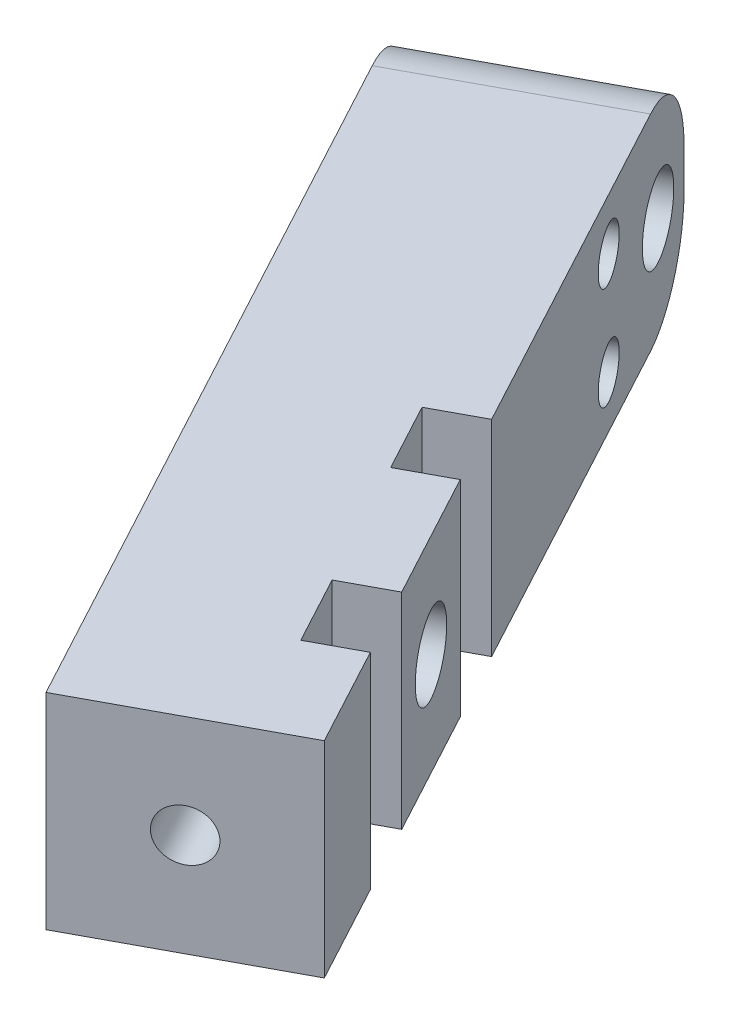
ISO-10303-21;
HEADER;
FILE_DESCRIPTION(('STEP AP214'),'2;1');
FILE_NAME('part.step','',(''),(''),'','','');
FILE_SCHEMA(('AUTOMOTIVE_DESIGN { 1 0 10303 214 1 1 1 1 }'));
ENDSEC;
DATA;
#1=APPLICATION_CONTEXT('core data for automotive mechanical design processes');
#2=APPLICATION_PROTOCOL_DEFINITION('international standard','automotive_design',2000,#1);
#3=PRODUCT_CONTEXT('',#1,'mechanical');
#4=PRODUCT('Part','Part','',(#3));
#5=PRODUCT_RELATED_PRODUCT_CATEGORY('part','',(#4));
#6=PRODUCT_DEFINITION_FORMATION('','',#4);
#7=PRODUCT_DEFINITION_CONTEXT('part definition',#1,'design');
#8=PRODUCT_DEFINITION('design','',#6,#7);
#9=PRODUCT_DEFINITION_SHAPE('','',#8);
#10=(LENGTH_UNIT() NAMED_UNIT(*) SI_UNIT(.MILLI.,.METRE.));
#11=(NAMED_UNIT(*) PLANE_ANGLE_UNIT() SI_UNIT($,.RADIAN.));
#12=(NAMED_UNIT(*) SI_UNIT($,.STERADIAN.) SOLID_ANGLE_UNIT());
#13=UNCERTAINTY_MEASURE_WITH_UNIT(LENGTH_MEASURE(1.E-05),#10,'distance_accuracy_value','');
#14=(GEOMETRIC_REPRESENTATION_CONTEXT(3) GLOBAL_UNCERTAINTY_ASSIGNED_CONTEXT((#13)) GLOBAL_UNIT_ASSIGNED_CONTEXT((#10,
#11,#12)) REPRESENTATION_CONTEXT('',''));
#15=CARTESIAN_POINT('',(0.,0.,0.));
#16=DIRECTION('',(0.,0.,1.));
#17=DIRECTION('',(1.,0.,0.));
#18=AXIS2_PLACEMENT_3D('',#15,#16,#17);
#19=CARTESIAN_POINT('',(473.518002347023,1000.,385.070267512742));
#20=DIRECTION('',(-0.473688349911593,0.,-0.8806925383799));
#21=DIRECTION('',(-0.8806925383799,0.,0.473688349911593));
#22=AXIS2_PLACEMENT_3D('',#19,#20,#21);
#23=PLANE('',#22);
#24=CARTESIAN_POINT('',(33.1717331570737,500.,621.914442468539));
#25=DIRECTION('',(0.473688349911594,0.,0.8806925383799));
#26=DIRECTION('',(0.8806925383799,0.,-0.473688349911594));
#27=AXIS2_PLACEMENT_3D('',#24,#25,#26);
#28=CIRCLE('',#27,125.);
#29=CARTESIAN_POINT('',(143.258300454561,500.,562.70339872959));
#30=VERTEX_POINT('',#29);
#31=EDGE_CURVE('E482',#30,#30,#28,.T.);
#32=ORIENTED_EDGE('',*,*,#31,.F.);
#33=EDGE_LOOP('',(#32));
#34=FACE_BOUND('',#33,.T.);
#35=DIRECTION('',(0.8806925383799,0.,-0.473688349911593));
#36=VECTOR('',#35,1.);
#37=CARTESIAN_POINT('',(473.518002347023,0.,385.070267512742));
#38=LINE('',#37,#36);
#39=CARTESIAN_POINT('',(-407.174536032876,0.,858.758617424335));
#40=VERTEX_POINT('',#39);
#41=CARTESIAN_POINT('',(473.518002347023,0.,385.070267512742));
#42=VERTEX_POINT('',#41);
#43=EDGE_CURVE('E159',#40,#42,#38,.T.);
#44=ORIENTED_EDGE('',*,*,#43,.T.);
#45=DIRECTION('',(0.,-1.,0.));
#46=VECTOR('',#45,1.);
#47=CARTESIAN_POINT('',(473.518002347023,1000.,385.070267512742));
#48=LINE('',#47,#46);
#49=CARTESIAN_POINT('',(473.518002347023,1000.,385.070267512742));
#50=VERTEX_POINT('',#49);
#51=EDGE_CURVE('E140',#50,#42,#48,.T.);
#52=ORIENTED_EDGE('',*,*,#51,.F.);
#53=DIRECTION('',(0.8806925383799,0.,-0.473688349911593));
#54=VECTOR('',#53,1.);
#55=CARTESIAN_POINT('',(473.518002347023,1000.,385.070267512742));
#56=LINE('',#55,#54);
#57=CARTESIAN_POINT('',(-407.174536032876,1000.,858.758617424335));
#58=VERTEX_POINT('',#57);
#59=EDGE_CURVE('E147',#58,#50,#56,.T.);
#60=ORIENTED_EDGE('',*,*,#59,.F.);
#61=DIRECTION('',(0.,-1.,0.));
#62=VECTOR('',#61,1.);
#63=CARTESIAN_POINT('',(-407.174536032876,1000.,858.758617424335));
#64=LINE('',#63,#62);
#65=EDGE_CURVE('E201',#58,#40,#64,.T.);
#66=ORIENTED_EDGE('',*,*,#65,.T.);
#67=EDGE_LOOP('',(#44,#52,#60,#66));
#68=FACE_BOUND('',#67,.T.);
#69=ADVANCED_FACE('F33',(#34,#68),#23,.F.);
#70=CARTESIAN_POINT('',(473.518002347023,1000.,385.070267512742));
#71=DIRECTION('',(-0.880692538379901,0.,0.473688349911593));
#72=DIRECTION('',(0.473688349911593,0.,0.880692538379901));
#73=AXIS2_PLACEMENT_3D('',#70,#71,#72);
#74=PLANE('',#73);
#75=DIRECTION('',(-0.473688349911593,0.,-0.880692538379901));
#76=VECTOR('',#75,1.);
#77=CARTESIAN_POINT('',(473.518002347023,0.,385.070267512742));
#78=LINE('',#77,#76);
#79=CARTESIAN_POINT('',(212.989409895647,0.,-99.3106285962031));
#80=VERTEX_POINT('',#79);
#81=EDGE_CURVE('E237',#42,#80,#78,.T.);
#82=ORIENTED_EDGE('',*,*,#81,.T.);
#83=DIRECTION('',(0.,-1.,0.));
#84=VECTOR('',#83,1.);
#85=CARTESIAN_POINT('',(212.989409895647,1000.,-99.3106285962031));
#86=LINE('',#85,#84);
#87=CARTESIAN_POINT('',(212.989409895647,1000.,-99.3106285962031));
#88=VERTEX_POINT('',#87);
#89=EDGE_CURVE('E143',#88,#80,#86,.T.);
#90=ORIENTED_EDGE('',*,*,#89,.F.);
#91=DIRECTION('',(-0.473688349911593,0.,-0.880692538379901));
#92=VECTOR('',#91,1.);
#93=CARTESIAN_POINT('',(473.518002347023,1000.,385.070267512742));
#94=LINE('',#93,#92);
#95=EDGE_CURVE('E136',#50,#88,#94,.T.);
#96=ORIENTED_EDGE('',*,*,#95,.F.);
#97=ORIENTED_EDGE('',*,*,#51,.T.);
#98=EDGE_LOOP('',(#82,#90,#96,#97));
#99=FACE_BOUND('',#98,.T.);
#100=ADVANCED_FACE('F138',(#99),#74,.F.);
#101=CARTESIAN_POINT('',(212.989409895647,1000.,-99.3106285962031));
#102=DIRECTION('',(0.473688349911593,0.,0.8806925383799));
#103=DIRECTION('',(0.8806925383799,0.,-0.473688349911593));
#104=AXIS2_PLACEMENT_3D('',#101,#102,#103);
#105=PLANE('',#104);
#106=DIRECTION('',(-0.8806925383799,0.,0.473688349911593));
#107=VECTOR('',#106,1.);
#108=CARTESIAN_POINT('',(212.989409895647,0.,-99.3106285962031));
#109=LINE('',#108,#107);
#110=CARTESIAN_POINT('',(-7.18372469931982,0.,19.1114588816911));
#111=VERTEX_POINT('',#110);
#112=EDGE_CURVE('E231',#80,#111,#109,.T.);
#113=ORIENTED_EDGE('',*,*,#112,.T.);
#114=DIRECTION('',(0.,-1.,0.));
#115=VECTOR('',#114,1.);
#116=CARTESIAN_POINT('',(-7.18372469931982,1000.,19.1114588816911));
#117=LINE('',#116,#115);
#118=CARTESIAN_POINT('',(-7.18372469931982,1000.,19.1114588816911));
#119=VERTEX_POINT('',#118);
#120=EDGE_CURVE('E165',#119,#111,#117,.T.);
#121=ORIENTED_EDGE('',*,*,#120,.F.);
#122=DIRECTION('',(-0.8806925383799,0.,0.473688349911593));
#123=VECTOR('',#122,1.);
#124=CARTESIAN_POINT('',(212.989409895647,1000.,-99.3106285962031));
#125=LINE('',#124,#123);
#126=EDGE_CURVE('E146',#88,#119,#125,.T.);
#127=ORIENTED_EDGE('',*,*,#126,.F.);
#128=ORIENTED_EDGE('',*,*,#89,.T.);
#129=EDGE_LOOP('',(#113,#121,#127,#128));
#130=FACE_BOUND('',#129,.T.);
#131=ADVANCED_FACE('F262',(#130),#105,.F.);
#132=CARTESIAN_POINT('',(-7.18372469931982,1000.,19.1114588816911));
#133=DIRECTION('',(-0.8806925383799,0.,0.473688349911593));
#134=DIRECTION('',(0.473688349911593,0.,0.8806925383799));
#135=AXIS2_PLACEMENT_3D('',#132,#133,#134);
#136=PLANE('',#135);
#137=DIRECTION('',(-0.473688349911593,0.,-0.8806925383799));
#138=VECTOR('',#137,1.);
#139=CARTESIAN_POINT('',(-7.18372469931982,0.,19.1114588816911));
#140=LINE('',#139,#138);
#141=CARTESIAN_POINT('',(-184.816855916168,0.,-311.148243010772));
#142=VERTEX_POINT('',#141);
#143=EDGE_CURVE('E226',#111,#142,#140,.T.);
#144=ORIENTED_EDGE('',*,*,#143,.T.);
#145=DIRECTION('',(0.,-1.,0.));
#146=VECTOR('',#145,1.);
#147=CARTESIAN_POINT('',(-184.816855916168,1000.,-311.148243010772));
#148=LINE('',#147,#146);
#149=CARTESIAN_POINT('',(-184.816855916168,1000.,-311.148243010772));
#150=VERTEX_POINT('',#149);
#151=EDGE_CURVE('E217',#150,#142,#148,.T.);
#152=ORIENTED_EDGE('',*,*,#151,.F.);
#153=DIRECTION('',(-0.473688349911593,0.,-0.8806925383799));
#154=VECTOR('',#153,1.);
#155=CARTESIAN_POINT('',(-7.18372469931982,1000.,19.1114588816911));
#156=LINE('',#155,#154);
#157=EDGE_CURVE('E227',#119,#150,#156,.T.);
#158=ORIENTED_EDGE('',*,*,#157,.F.);
#159=ORIENTED_EDGE('',*,*,#120,.T.);
#160=EDGE_LOOP('',(#144,#152,#158,#159));
#161=FACE_BOUND('',#160,.T.);
#162=ADVANCED_FACE('F224',(#161),#136,.F.);
#163=CARTESIAN_POINT('',(-184.816855916168,1000.,-311.148243010772));
#164=DIRECTION('',(-0.473688349911593,0.,-0.8806925383799));
#165=DIRECTION('',(-0.8806925383799,0.,0.473688349911593));
#166=AXIS2_PLACEMENT_3D('',#163,#164,#165);
#167=PLANE('',#166);
#168=DIRECTION('',(0.8806925383799,0.,-0.473688349911593));
#169=VECTOR('',#168,1.);
#170=CARTESIAN_POINT('',(-184.816855916168,0.,-311.148243010772));
#171=LINE('',#170,#169);
#172=CARTESIAN_POINT('',(35.3562786788065,0.,-429.57033048867));
#173=VERTEX_POINT('',#172);
#174=EDGE_CURVE('E233',#142,#173,#171,.T.);
#175=ORIENTED_EDGE('',*,*,#174,.T.);
#176=DIRECTION('',(0.,-1.,0.));
#177=VECTOR('',#176,1.);
#178=CARTESIAN_POINT('',(35.3562786788065,1000.,-429.57033048867));
#179=LINE('',#178,#177);
#180=CARTESIAN_POINT('',(35.3562786788065,1000.,-429.57033048867));
#181=VERTEX_POINT('',#180);
#182=EDGE_CURVE('E214',#181,#173,#179,.T.);
#183=ORIENTED_EDGE('',*,*,#182,.F.);
#184=DIRECTION('',(0.8806925383799,0.,-0.473688349911593));
#185=VECTOR('',#184,1.);
#186=CARTESIAN_POINT('',(-184.816855916168,1000.,-311.148243010772));
#187=LINE('',#186,#185);
#188=EDGE_CURVE('E264',#150,#181,#187,.T.);
#189=ORIENTED_EDGE('',*,*,#188,.F.);
#190=ORIENTED_EDGE('',*,*,#151,.T.);
#191=EDGE_LOOP('',(#175,#183,#189,#190));
#192=FACE_BOUND('',#191,.T.);
#193=ADVANCED_FACE('F286',(#192),#167,.F.);
#194=CARTESIAN_POINT('',(35.3562786788065,1000.,-429.57033048867));
#195=DIRECTION('',(-0.8806925383799,0.,0.473688349911593));
#196=DIRECTION('',(0.473688349911593,0.,0.8806925383799));
#197=AXIS2_PLACEMENT_3D('',#194,#195,#196);
#198=PLANE('',#197);
#199=CARTESIAN_POINT('',(-130.434643790251,500.,-737.812718921635));
#200=DIRECTION('',(0.8806925383799,0.,-0.473688349911594));
#201=DIRECTION('',(-0.473688349911594,0.,-0.8806925383799));
#202=AXIS2_PLACEMENT_3D('',#199,#200,#201);
#203=CIRCLE('',#202,187.5);
#204=CARTESIAN_POINT('',(-219.251209398675,500.,-902.942569867866));
#205=VERTEX_POINT('',#204);
#206=EDGE_CURVE('E504',#205,#205,#203,.T.);
#207=ORIENTED_EDGE('',*,*,#206,.F.);
#208=EDGE_LOOP('',(#207));
#209=FACE_BOUND('',#208,.T.);
#210=DIRECTION('',(-0.473688349911593,0.,-0.8806925383799));
#211=VECTOR('',#210,1.);
#212=CARTESIAN_POINT('',(35.3562786788065,0.,-429.57033048867));
#213=LINE('',#212,#211);
#214=CARTESIAN_POINT('',(-296.225566259309,0.,-1046.0551073546));
#215=VERTEX_POINT('',#214);
#216=EDGE_CURVE('E235',#173,#215,#213,.T.);
#217=ORIENTED_EDGE('',*,*,#216,.T.);
#218=DIRECTION('',(0.,-1.,0.));
#219=VECTOR('',#218,1.);
#220=CARTESIAN_POINT('',(-296.225566259309,1000.,-1046.0551073546));
#221=LINE('',#220,#219);
#222=CARTESIAN_POINT('',(-296.225566259309,1000.,-1046.0551073546));
#223=VERTEX_POINT('',#222);
#224=EDGE_CURVE('E211',#223,#215,#221,.T.);
#225=ORIENTED_EDGE('',*,*,#224,.F.);
#226=DIRECTION('',(-0.473688349911593,0.,-0.8806925383799));
#227=VECTOR('',#226,1.);
#228=CARTESIAN_POINT('',(35.3562786788065,1000.,-429.57033048867));
#229=LINE('',#228,#227);
#230=EDGE_CURVE('E268',#181,#223,#229,.T.);
#231=ORIENTED_EDGE('',*,*,#230,.F.);
#232=ORIENTED_EDGE('',*,*,#182,.T.);
#233=EDGE_LOOP('',(#217,#225,#231,#232));
#234=FACE_BOUND('',#233,.T.);
#235=ADVANCED_FACE('F282',(#209,#234),#198,.F.);
#236=CARTESIAN_POINT('',(-296.225566259309,1000.,-1046.0551073546));
#237=DIRECTION('',(0.473688349911594,0.,0.8806925383799));
#238=DIRECTION('',(0.8806925383799,0.,-0.473688349911594));
#239=AXIS2_PLACEMENT_3D('',#236,#237,#238);
#240=PLANE('',#239);
#241=DIRECTION('',(-0.8806925383799,0.,0.473688349911594));
#242=VECTOR('',#241,1.);
#243=CARTESIAN_POINT('',(-296.225566259309,0.,-1046.0551073546));
#244=LINE('',#243,#242);
#245=CARTESIAN_POINT('',(-516.398700854284,0.,-927.633019876701));
#246=VERTEX_POINT('',#245);
#247=EDGE_CURVE('E242',#215,#246,#244,.T.);
#248=ORIENTED_EDGE('',*,*,#247,.T.);
#249=DIRECTION('',(0.,-1.,0.));
#250=VECTOR('',#249,1.);
#251=CARTESIAN_POINT('',(-516.398700854284,1000.,-927.633019876701));
#252=LINE('',#251,#250);
#253=CARTESIAN_POINT('',(-516.398700854284,1000.,-927.633019876701));
#254=VERTEX_POINT('',#253);
#255=EDGE_CURVE('E208',#254,#246,#252,.T.);
#256=ORIENTED_EDGE('',*,*,#255,.F.);
#257=DIRECTION('',(-0.8806925383799,0.,0.473688349911594));
#258=VECTOR('',#257,1.);
#259=CARTESIAN_POINT('',(-296.225566259309,1000.,-1046.0551073546));
#260=LINE('',#259,#258);
#261=EDGE_CURVE('E270',#223,#254,#260,.T.);
#262=ORIENTED_EDGE('',*,*,#261,.F.);
#263=ORIENTED_EDGE('',*,*,#224,.T.);
#264=EDGE_LOOP('',(#248,#256,#262,#263));
#265=FACE_BOUND('',#264,.T.);
#266=ADVANCED_FACE('F278',(#265),#240,.F.);
#267=CARTESIAN_POINT('',(-516.398700854284,1000.,-927.633019876701));
#268=DIRECTION('',(-0.8806925383799,0.,0.473688349911593));
#269=DIRECTION('',(0.473688349911593,0.,0.8806925383799));
#270=AXIS2_PLACEMENT_3D('',#267,#268,#269);
#271=PLANE('',#270);
#272=DIRECTION('',(-0.473688349911593,0.,-0.8806925383799));
#273=VECTOR('',#272,1.);
#274=CARTESIAN_POINT('',(-516.398700854284,0.,-927.633019876701));
#275=LINE('',#274,#273);
#276=CARTESIAN_POINT('',(-694.031832071131,0.,-1257.89272176916));
#277=VERTEX_POINT('',#276);
#278=EDGE_CURVE('E244',#246,#277,#275,.T.);
#279=ORIENTED_EDGE('',*,*,#278,.T.);
#280=DIRECTION('',(0.,-1.,0.));
#281=VECTOR('',#280,1.);
#282=CARTESIAN_POINT('',(-694.031832071131,1000.,-1257.89272176916));
#283=LINE('',#282,#281);
#284=CARTESIAN_POINT('',(-694.031832071131,1000.,-1257.89272176916));
#285=VERTEX_POINT('',#284);
#286=EDGE_CURVE('E205',#285,#277,#283,.T.);
#287=ORIENTED_EDGE('',*,*,#286,.F.);
#288=DIRECTION('',(-0.473688349911593,0.,-0.8806925383799));
#289=VECTOR('',#288,1.);
#290=CARTESIAN_POINT('',(-516.398700854284,1000.,-927.633019876701));
#291=LINE('',#290,#289);
#292=EDGE_CURVE('E257',#254,#285,#291,.T.);
#293=ORIENTED_EDGE('',*,*,#292,.F.);
#294=ORIENTED_EDGE('',*,*,#255,.T.);
#295=EDGE_LOOP('',(#279,#287,#293,#294));
#296=FACE_BOUND('',#295,.T.);
#297=ADVANCED_FACE('F275',(#296),#271,.F.);
#298=CARTESIAN_POINT('',(-694.031832071131,1000.,-1257.89272176916));
#299=DIRECTION('',(-0.473688349911593,0.,-0.8806925383799));
#300=DIRECTION('',(-0.8806925383799,0.,0.473688349911593));
#301=AXIS2_PLACEMENT_3D('',#298,#299,#300);
#302=PLANE('',#301);
#303=DIRECTION('',(0.8806925383799,0.,-0.473688349911593));
#304=VECTOR('',#303,1.);
#305=CARTESIAN_POINT('',(-694.031832071131,0.,-1257.89272176916));
#306=LINE('',#305,#304);
#307=CARTESIAN_POINT('',(-473.858697476159,0.,-1376.31480924706));
#308=VERTEX_POINT('',#307);
#309=EDGE_CURVE('E197',#277,#308,#306,.T.);
#310=ORIENTED_EDGE('',*,*,#309,.T.);
#311=DIRECTION('',(0.,-1.,0.));
#312=VECTOR('',#311,1.);
#313=CARTESIAN_POINT('',(-473.858697476159,1000.,-1376.31480924706));
#314=LINE('',#313,#312);
#315=CARTESIAN_POINT('',(-473.858697476159,1000.,-1376.31480924706));
#316=VERTEX_POINT('',#315);
#317=EDGE_CURVE('E203',#316,#308,#314,.T.);
#318=ORIENTED_EDGE('',*,*,#317,.F.);
#319=DIRECTION('',(0.8806925383799,0.,-0.473688349911593));
#320=VECTOR('',#319,1.);
#321=CARTESIAN_POINT('',(-694.031832071131,1000.,-1257.89272176916));
#322=LINE('',#321,#320);
#323=EDGE_CURVE('E254',#285,#316,#322,.T.);
#324=ORIENTED_EDGE('',*,*,#323,.F.);
#325=ORIENTED_EDGE('',*,*,#286,.T.);
#326=EDGE_LOOP('',(#310,#318,#324,#325));
#327=FACE_BOUND('',#326,.T.);
#328=ADVANCED_FACE('F248',(#327),#302,.F.);
#329=CARTESIAN_POINT('',(-473.858697476159,1000.,-1376.31480924706));
#330=DIRECTION('',(-0.8806925383799,0.,0.473688349911594));
#331=DIRECTION('',(0.473688349911594,0.,0.8806925383799));
#332=AXIS2_PLACEMENT_3D('',#329,#330,#331);
#333=PLANE('',#332);
#334=CARTESIAN_POINT('',(-1137.02238735239,750.,-2609.28436297892));
#335=DIRECTION('',(0.8806925383799,0.,-0.473688349911594));
#336=DIRECTION('',(-0.473688349911594,0.,-0.8806925383799));
#337=AXIS2_PLACEMENT_3D('',#334,#335,#336);
#338=CIRCLE('',#337,125.);
#339=CARTESIAN_POINT('',(-1196.23343109134,750.,-2719.37093027641));
#340=VERTEX_POINT('',#339);
#341=EDGE_CURVE('E490',#340,#340,#338,.T.);
#342=ORIENTED_EDGE('',*,*,#341,.F.);
#343=EDGE_LOOP('',(#342));
#344=FACE_BOUND('',#343,.T.);
#345=CARTESIAN_POINT('',(-1137.02238735239,250.,-2609.28436297892));
#346=DIRECTION('',(0.8806925383799,0.,-0.473688349911594));
#347=DIRECTION('',(-0.473688349911594,0.,-0.8806925383799));
#348=AXIS2_PLACEMENT_3D('',#345,#346,#347);
#349=CIRCLE('',#348,125.);
#350=CARTESIAN_POINT('',(-1196.23343109134,250.,-2719.37093027641));
#351=VERTEX_POINT('',#350);
#352=EDGE_CURVE('E481',#351,#351,#349,.T.);
#353=ORIENTED_EDGE('',*,*,#352,.F.);
#354=EDGE_LOOP('',(#353));
#355=FACE_BOUND('',#354,.T.);
#356=CARTESIAN_POINT('',(-1416.49851380023,500.,-3128.89296062306));
#357=DIRECTION('',(0.8806925383799,0.,-0.473688349911594));
#358=DIRECTION('',(-0.473688349911594,0.,-0.8806925383799));
#359=AXIS2_PLACEMENT_3D('',#356,#357,#358);
#360=CIRCLE('',#359,187.5);
#361=CARTESIAN_POINT('',(-1505.31507940865,500.,-3294.02281156929));
#362=VERTEX_POINT('',#361);
#363=EDGE_CURVE('E495',#362,#362,#360,.T.);
#364=ORIENTED_EDGE('',*,*,#363,.F.);
#365=EDGE_LOOP('',(#364));
#366=FACE_BOUND('',#365,.T.);
#367=DIRECTION('',(-0.473688349911594,0.,-0.8806925383799));
#368=VECTOR('',#367,1.);
#369=CARTESIAN_POINT('',(-473.858697476159,0.,-1376.31480924706));
#370=LINE('',#369,#368);
#371=CARTESIAN_POINT('',(-1373.86656230819,0.,-3049.63063216887));
#372=VERTEX_POINT('',#371);
#373=EDGE_CURVE('E181',#308,#372,#370,.T.);
#374=ORIENTED_EDGE('',*,*,#373,.T.);
#375=CARTESIAN_POINT('',(-1373.86656230819,400.,-3049.63063216887));
#376=DIRECTION('',(-0.8806925383799,0.,0.473688349911594));
#377=DIRECTION('',(0.473688349911594,0.,0.8806925383799));
#378=AXIS2_PLACEMENT_3D('',#375,#376,#377);
#379=CIRCLE('',#378,400.);
#380=CARTESIAN_POINT('',(-1563.34190227283,400.,-3401.90764752083));
#381=VERTEX_POINT('',#380);
#382=EDGE_CURVE('E41',#372,#381,#379,.F.);
#383=ORIENTED_EDGE('',*,*,#382,.T.);
#384=DIRECTION('',(0.,-1.,0.));
#385=VECTOR('',#384,1.);
#386=CARTESIAN_POINT('',(-1563.34190227283,0.,-3401.90764752083));
#387=LINE('',#386,#385);
#388=CARTESIAN_POINT('',(-1563.34190227283,600.,-3401.90764752083));
#389=VERTEX_POINT('',#388);
#390=EDGE_CURVE('E179',#389,#381,#387,.T.);
#391=ORIENTED_EDGE('',*,*,#390,.F.);
#392=CARTESIAN_POINT('',(-1373.86656230819,600.,-3049.63063216887));
#393=DIRECTION('',(-0.8806925383799,0.,0.473688349911594));
#394=DIRECTION('',(0.473688349911594,0.,0.8806925383799));
#395=AXIS2_PLACEMENT_3D('',#392,#393,#394);
#396=CIRCLE('',#395,400.);
#397=CARTESIAN_POINT('',(-1373.86656230819,1000.,-3049.63063216887));
#398=VERTEX_POINT('',#397);
#399=EDGE_CURVE('E48',#389,#398,#396,.F.);
#400=ORIENTED_EDGE('',*,*,#399,.T.);
#401=DIRECTION('',(-0.473688349911594,0.,-0.8806925383799));
#402=VECTOR('',#401,1.);
#403=CARTESIAN_POINT('',(-473.858697476159,1000.,-1376.31480924706));
#404=LINE('',#403,#402);
#405=EDGE_CURVE('E252',#316,#398,#404,.T.);
#406=ORIENTED_EDGE('',*,*,#405,.F.);
#407=ORIENTED_EDGE('',*,*,#317,.T.);
#408=EDGE_LOOP('',(#374,#383,#391,#400,#406,#407));
#409=FACE_BOUND('',#408,.T.);
#410=ADVANCED_FACE('F178',(#344,#355,#366,#409),#333,.F.);
#411=CARTESIAN_POINT('',(-407.174536032876,1000.,858.758617424335));
#412=DIRECTION('',(0.8806925383799,0.,-0.473688349911593));
#413=DIRECTION('',(-0.473688349911593,0.,-0.8806925383799));
#414=AXIS2_PLACEMENT_3D('',#411,#412,#413);
#415=PLANE('',#414);
#416=CARTESIAN_POINT('',(-2017.71492573229,750.,-2135.59601306733));
#417=DIRECTION('',(0.8806925383799,0.,-0.473688349911593));
#418=DIRECTION('',(-0.473688349911593,0.,-0.8806925383799));
#419=AXIS2_PLACEMENT_3D('',#416,#417,#418);
#420=CIRCLE('',#419,125.);
#421=CARTESIAN_POINT('',(-2076.92596947124,750.,-2245.68258036481));
#422=VERTEX_POINT('',#421);
#423=EDGE_CURVE('E493',#422,#422,#420,.F.);
#424=ORIENTED_EDGE('',*,*,#423,.F.);
#425=EDGE_LOOP('',(#424));
#426=FACE_BOUND('',#425,.T.);
#427=CARTESIAN_POINT('',(-2017.71492573229,250.,-2135.59601306733));
#428=DIRECTION('',(0.8806925383799,0.,-0.473688349911593));
#429=DIRECTION('',(-0.473688349911593,0.,-0.8806925383799));
#430=AXIS2_PLACEMENT_3D('',#427,#428,#429);
#431=CIRCLE('',#430,125.);
#432=CARTESIAN_POINT('',(-2076.92596947124,250.,-2245.68258036481));
#433=VERTEX_POINT('',#432);
#434=EDGE_CURVE('E485',#433,#433,#431,.F.);
#435=ORIENTED_EDGE('',*,*,#434,.F.);
#436=EDGE_LOOP('',(#435));
#437=FACE_BOUND('',#436,.T.);
#438=CARTESIAN_POINT('',(-1011.12718217016,500.,-264.124369010038));
#439=DIRECTION('',(0.8806925383799,0.,-0.473688349911593));
#440=DIRECTION('',(-0.473688349911593,0.,-0.8806925383799));
#441=AXIS2_PLACEMENT_3D('',#438,#439,#440);
#442=CIRCLE('',#441,187.5);
#443=CARTESIAN_POINT('',(-1099.94374777858,500.,-429.254219956269));
#444=VERTEX_POINT('',#443);
#445=EDGE_CURVE('E261',#444,#444,#442,.F.);
#446=ORIENTED_EDGE('',*,*,#445,.F.);
#447=EDGE_LOOP('',(#446));
#448=FACE_BOUND('',#447,.T.);
#449=DIRECTION('',(0.,1.,0.));
#450=VECTOR('',#449,1.);
#451=CARTESIAN_POINT('',(-2444.03444065273,0.,-2928.21929760924));
#452=LINE('',#451,#450);
#453=CARTESIAN_POINT('',(-2444.03444065273,400.,-2928.21929760924));
#454=VERTEX_POINT('',#453);
#455=CARTESIAN_POINT('',(-2444.03444065273,600.,-2928.21929760924));
#456=VERTEX_POINT('',#455);
#457=EDGE_CURVE('E189',#454,#456,#452,.T.);
#458=ORIENTED_EDGE('',*,*,#457,.F.);
#459=CARTESIAN_POINT('',(-2254.55910068809,400.,-2575.94228225728));
#460=DIRECTION('',(0.8806925383799,0.,-0.473688349911593));
#461=DIRECTION('',(-0.473688349911593,0.,-0.8806925383799));
#462=AXIS2_PLACEMENT_3D('',#459,#460,#461);
#463=CIRCLE('',#462,400.);
#464=CARTESIAN_POINT('',(-2254.55910068809,0.,-2575.94228225728));
#465=VERTEX_POINT('',#464);
#466=EDGE_CURVE('E173',#454,#465,#463,.F.);
#467=ORIENTED_EDGE('',*,*,#466,.T.);
#468=DIRECTION('',(0.473688349911593,0.,0.8806925383799));
#469=VECTOR('',#468,1.);
#470=CARTESIAN_POINT('',(-407.174536032876,0.,858.758617424335));
#471=LINE('',#470,#469);
#472=EDGE_CURVE('E156',#465,#40,#471,.T.);
#473=ORIENTED_EDGE('',*,*,#472,.T.);
#474=ORIENTED_EDGE('',*,*,#65,.F.);
#475=DIRECTION('',(0.473688349911593,0.,0.8806925383799));
#476=VECTOR('',#475,1.);
#477=CARTESIAN_POINT('',(-407.174536032876,1000.,858.758617424335));
#478=LINE('',#477,#476);
#479=CARTESIAN_POINT('',(-2254.55910068809,1000.,-2575.94228225728));
#480=VERTEX_POINT('',#479);
#481=EDGE_CURVE('E152',#480,#58,#478,.T.);
#482=ORIENTED_EDGE('',*,*,#481,.F.);
#483=CARTESIAN_POINT('',(-2254.55910068809,600.,-2575.94228225728));
#484=DIRECTION('',(0.8806925383799,0.,-0.473688349911593));
#485=DIRECTION('',(-0.473688349911593,0.,-0.8806925383799));
#486=AXIS2_PLACEMENT_3D('',#483,#484,#485);
#487=CIRCLE('',#486,400.);
#488=EDGE_CURVE('E171',#480,#456,#487,.F.);
#489=ORIENTED_EDGE('',*,*,#488,.T.);
#490=EDGE_LOOP('',(#458,#467,#473,#474,#482,#489));
#491=FACE_BOUND('',#490,.T.);
#492=ADVANCED_FACE('F194',(#426,#437,#448,#491),#415,.F.);
#493=CARTESIAN_POINT('',(0.,1000.,0.));
#494=DIRECTION('',(0.,-1.,0.));
#495=DIRECTION('',(0.,0.,-1.));
#496=AXIS2_PLACEMENT_3D('',#493,#494,#495);
#497=PLANE('',#496);
#498=ORIENTED_EDGE('',*,*,#405,.T.);
#499=DIRECTION('',(0.8806925383799,0.,-0.473688349911593));
#500=VECTOR('',#499,1.);
#501=CARTESIAN_POINT('',(-1580.49506120661,1000.,-2938.49364800871));
#502=LINE('',#501,#500);
#503=EDGE_CURVE('E11',#398,#480,#502,.F.);
#504=ORIENTED_EDGE('',*,*,#503,.T.);
#505=ORIENTED_EDGE('',*,*,#481,.T.);
#506=ORIENTED_EDGE('',*,*,#59,.T.);
#507=ORIENTED_EDGE('',*,*,#95,.T.);
#508=ORIENTED_EDGE('',*,*,#126,.T.);
#509=ORIENTED_EDGE('',*,*,#157,.T.);
#510=ORIENTED_EDGE('',*,*,#188,.T.);
#511=ORIENTED_EDGE('',*,*,#230,.T.);
#512=ORIENTED_EDGE('',*,*,#261,.T.);
#513=ORIENTED_EDGE('',*,*,#292,.T.);
#514=ORIENTED_EDGE('',*,*,#323,.T.);
#515=EDGE_LOOP('',(#498,#504,#505,#506,#507,#508,#509,#510,#511,#512,#513,#514));
#516=FACE_BOUND('',#515,.T.);
#517=ADVANCED_FACE('F150',(#516),#497,.F.);
#518=CARTESIAN_POINT('',(0.,0.,0.));
#519=DIRECTION('',(0.,-1.,0.));
#520=DIRECTION('',(0.,0.,-1.));
#521=AXIS2_PLACEMENT_3D('',#518,#519,#520);
#522=PLANE('',#521);
#523=ORIENTED_EDGE('',*,*,#472,.F.);
#524=DIRECTION('',(-0.8806925383799,0.,0.473688349911593));
#525=VECTOR('',#524,1.);
#526=CARTESIAN_POINT('',(-1373.86656230819,0.,-3049.63063216887));
#527=LINE('',#526,#525);
#528=EDGE_CURVE('E56',#465,#372,#527,.F.);
#529=ORIENTED_EDGE('',*,*,#528,.T.);
#530=ORIENTED_EDGE('',*,*,#373,.F.);
#531=ORIENTED_EDGE('',*,*,#309,.F.);
#532=ORIENTED_EDGE('',*,*,#278,.F.);
#533=ORIENTED_EDGE('',*,*,#247,.F.);
#534=ORIENTED_EDGE('',*,*,#216,.F.);
#535=ORIENTED_EDGE('',*,*,#174,.F.);
#536=ORIENTED_EDGE('',*,*,#143,.F.);
#537=ORIENTED_EDGE('',*,*,#112,.F.);
#538=ORIENTED_EDGE('',*,*,#81,.F.);
#539=ORIENTED_EDGE('',*,*,#43,.F.);
#540=EDGE_LOOP('',(#523,#529,#530,#531,#532,#533,#534,#535,#536,#537,#538,#539));
#541=FACE_BOUND('',#540,.T.);
#542=ADVANCED_FACE('F195',(#541),#522,.T.);
#543=CARTESIAN_POINT('',(-2477.06175133533,500.,524.341635736192));
#544=DIRECTION('',(0.8806925383799,0.,-0.473688349911593));
#545=DIRECTION('',(-0.473688349911593,0.,-0.8806925383799));
#546=AXIS2_PLACEMENT_3D('',#543,#544,#545);
#547=CYLINDRICAL_SURFACE('',#546,187.5);
#548=ORIENTED_EDGE('',*,*,#206,.T.);
#549=EDGE_LOOP('',(#548));
#550=FACE_BOUND('',#549,.T.);
#551=ORIENTED_EDGE('',*,*,#445,.T.);
#552=EDGE_LOOP('',(#551));
#553=FACE_BOUND('',#552,.T.);
#554=ADVANCED_FACE('F312',(#550,#553),#547,.F.);
#555=CARTESIAN_POINT('',(-1769.97040117124,0.,-3290.77066336067));
#556=DIRECTION('',(0.473688349911593,0.,0.8806925383799));
#557=DIRECTION('',(0.8806925383799,0.,-0.473688349911593));
#558=AXIS2_PLACEMENT_3D('',#555,#556,#557);
#559=PLANE('',#558);
#560=ORIENTED_EDGE('',*,*,#390,.T.);
#561=DIRECTION('',(-0.8806925383799,0.,0.473688349911593));
#562=VECTOR('',#561,1.);
#563=CARTESIAN_POINT('',(-2444.03444065273,400.,-2928.21929760924));
#564=LINE('',#563,#562);
#565=EDGE_CURVE('E163',#381,#454,#564,.T.);
#566=ORIENTED_EDGE('',*,*,#565,.T.);
#567=ORIENTED_EDGE('',*,*,#457,.T.);
#568=DIRECTION('',(0.8806925383799,0.,-0.473688349911593));
#569=VECTOR('',#568,1.);
#570=CARTESIAN_POINT('',(-1769.97040117124,600.,-3290.77066336067));
#571=LINE('',#570,#569);
#572=EDGE_CURVE('E160',#456,#389,#571,.T.);
#573=ORIENTED_EDGE('',*,*,#572,.T.);
#574=EDGE_LOOP('',(#560,#566,#567,#573));
#575=FACE_BOUND('',#574,.T.);
#576=ADVANCED_FACE('F185',(#575),#559,.F.);
#577=CARTESIAN_POINT('',(-1580.49506120661,400.,-2938.49364800871));
#578=DIRECTION('',(0.8806925383799,0.,-0.473688349911593));
#579=DIRECTION('',(-0.473688349911593,0.,-0.8806925383799));
#580=AXIS2_PLACEMENT_3D('',#577,#578,#579);
#581=CYLINDRICAL_SURFACE('',#580,400.);
#582=ORIENTED_EDGE('',*,*,#382,.F.);
#583=ORIENTED_EDGE('',*,*,#528,.F.);
#584=ORIENTED_EDGE('',*,*,#466,.F.);
#585=ORIENTED_EDGE('',*,*,#565,.F.);
#586=EDGE_LOOP('',(#582,#583,#584,#585));
#587=FACE_BOUND('',#586,.T.);
#588=ADVANCED_FACE('F192',(#587),#581,.T.);
#589=CARTESIAN_POINT('',(-1580.49506120661,600.,-2938.49364800871));
#590=DIRECTION('',(0.8806925383799,0.,-0.473688349911593));
#591=DIRECTION('',(-0.473688349911593,0.,-0.8806925383799));
#592=AXIS2_PLACEMENT_3D('',#589,#590,#591);
#593=CYLINDRICAL_SURFACE('',#592,400.);
#594=ORIENTED_EDGE('',*,*,#488,.F.);
#595=ORIENTED_EDGE('',*,*,#503,.F.);
#596=ORIENTED_EDGE('',*,*,#399,.F.);
#597=ORIENTED_EDGE('',*,*,#572,.F.);
#598=EDGE_LOOP('',(#594,#595,#596,#597));
#599=FACE_BOUND('',#598,.T.);
#600=ADVANCED_FACE('F35',(#599),#593,.T.);
#601=CARTESIAN_POINT('',(-1988.94866374717,500.,-2820.99553318053));
#602=DIRECTION('',(0.8806925383799,0.,-0.473688349911594));
#603=DIRECTION('',(-0.473688349911594,0.,-0.8806925383799));
#604=AXIS2_PLACEMENT_3D('',#601,#602,#603);
#605=CYLINDRICAL_SURFACE('',#604,187.5);
#606=CARTESIAN_POINT('',(-1988.94866374717,500.,-2820.99553318053));
#607=DIRECTION('',(0.8806925383799,0.,-0.473688349911594));
#608=DIRECTION('',(-0.473688349911594,0.,-0.8806925383799));
#609=AXIS2_PLACEMENT_3D('',#606,#607,#608);
#610=CIRCLE('',#609,187.5);
#611=CARTESIAN_POINT('',(-2077.76522935559,500.,-2986.12538412676));
#612=VERTEX_POINT('',#611);
#613=EDGE_CURVE('E190',#612,#612,#610,.T.);
#614=ORIENTED_EDGE('',*,*,#613,.F.);
#615=EDGE_LOOP('',(#614));
#616=FACE_BOUND('',#615,.T.);
#617=ORIENTED_EDGE('',*,*,#363,.T.);
#618=EDGE_LOOP('',(#617));
#619=FACE_BOUND('',#618,.T.);
#620=ADVANCED_FACE('F310',(#616,#619),#605,.F.);
#621=CARTESIAN_POINT('',(-1988.94866374717,500.,-2820.99553318053));
#622=DIRECTION('',(0.8806925383799,0.,-0.473688349911594));
#623=DIRECTION('',(-0.473688349911594,0.,-0.8806925383799));
#624=AXIS2_PLACEMENT_3D('',#621,#622,#623);
#625=PLANE('',#624);
#626=ORIENTED_EDGE('',*,*,#613,.T.);
#627=EDGE_LOOP('',(#626));
#628=FACE_BOUND('',#627,.T.);
#629=ADVANCED_FACE('F428',(#628),#625,.T.);
#630=CARTESIAN_POINT('',(-3597.54406799906,250.,-1285.87079463953));
#631=DIRECTION('',(0.8806925383799,0.,-0.473688349911594));
#632=DIRECTION('',(-0.473688349911594,0.,-0.8806925383799));
#633=AXIS2_PLACEMENT_3D('',#630,#631,#632);
#634=CYLINDRICAL_SURFACE('',#633,125.);
#635=ORIENTED_EDGE('',*,*,#352,.T.);
#636=EDGE_LOOP('',(#635));
#637=FACE_BOUND('',#636,.T.);
#638=ORIENTED_EDGE('',*,*,#434,.T.);
#639=EDGE_LOOP('',(#638));
#640=FACE_BOUND('',#639,.T.);
#641=ADVANCED_FACE('F435',(#637,#640),#634,.F.);
#642=CARTESIAN_POINT('',(-3597.54406799906,750.,-1285.87079463953));
#643=DIRECTION('',(0.8806925383799,0.,-0.473688349911594));
#644=DIRECTION('',(-0.473688349911594,0.,-0.8806925383799));
#645=AXIS2_PLACEMENT_3D('',#642,#643,#644);
#646=CYLINDRICAL_SURFACE('',#645,125.);
#647=ORIENTED_EDGE('',*,*,#341,.T.);
#648=EDGE_LOOP('',(#647));
#649=FACE_BOUND('',#648,.T.);
#650=ORIENTED_EDGE('',*,*,#423,.T.);
#651=EDGE_LOOP('',(#650));
#652=FACE_BOUND('',#651,.T.);
#653=ADVANCED_FACE('F442',(#649,#652),#646,.F.);
#654=CARTESIAN_POINT('',(-298.410111781042,500.,5.42966560260927));
#655=DIRECTION('',(0.473688349911594,0.,0.8806925383799));
#656=DIRECTION('',(0.8806925383799,0.,-0.473688349911594));
#657=AXIS2_PLACEMENT_3D('',#654,#655,#656);
#658=CYLINDRICAL_SURFACE('',#657,125.);
#659=CARTESIAN_POINT('',(-298.410111781042,500.,5.42966560260927));
#660=DIRECTION('',(0.473688349911594,0.,0.8806925383799));
#661=DIRECTION('',(0.8806925383799,0.,-0.473688349911594));
#662=AXIS2_PLACEMENT_3D('',#659,#660,#661);
#663=CIRCLE('',#662,125.);
#664=CARTESIAN_POINT('',(-188.323544483554,500.,-53.7813781363399));
#665=VERTEX_POINT('',#664);
#666=EDGE_CURVE('E480',#665,#665,#663,.T.);
#667=ORIENTED_EDGE('',*,*,#666,.F.);
#668=EDGE_LOOP('',(#667));
#669=FACE_BOUND('',#668,.T.);
#670=ORIENTED_EDGE('',*,*,#31,.T.);
#671=EDGE_LOOP('',(#670));
#672=FACE_BOUND('',#671,.T.);
#673=ADVANCED_FACE('F451',(#669,#672),#658,.F.);
#674=CARTESIAN_POINT('',(-298.410111781042,500.,5.42966560260927));
#675=DIRECTION('',(0.473688349911594,0.,0.8806925383799));
#676=DIRECTION('',(0.8806925383799,0.,-0.473688349911594));
#677=AXIS2_PLACEMENT_3D('',#674,#675,#676);
#678=PLANE('',#677);
#679=ORIENTED_EDGE('',*,*,#666,.T.);
#680=EDGE_LOOP('',(#679));
#681=FACE_BOUND('',#680,.T.);
#682=ADVANCED_FACE('F460',(#681),#678,.T.);
#683=CLOSED_SHELL('',(#69,#100,#131,#162,#193,#235,#266,#297,#328,#410,#492,#517,#542,#554,#576,
#588,#600,#620,#629,#641,#653,#673,#682));
#684=MANIFOLD_SOLID_BREP('B2',#683);
#685=ADVANCED_BREP_SHAPE_REPRESENTATION('',(#18,#684),#14);
#686=SHAPE_DEFINITION_REPRESENTATION(#9,#685);
ENDSEC;
END-ISO-10303-21;
